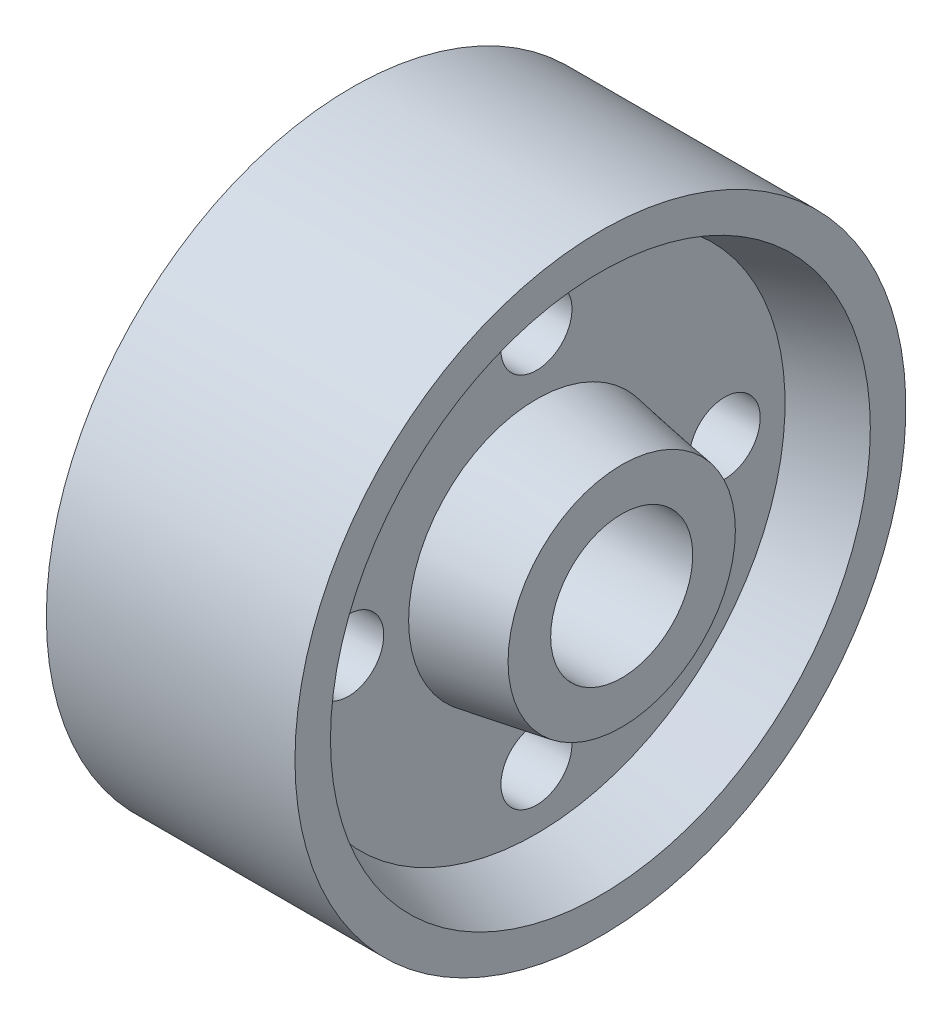
ISO-10303-21;
HEADER;
FILE_DESCRIPTION(('STEP AP214'),'2;1');
FILE_NAME('part.step','',(''),(''),'','','');
FILE_SCHEMA(('AUTOMOTIVE_DESIGN { 1 0 10303 214 1 1 1 1 }'));
ENDSEC;
DATA;
#1=APPLICATION_CONTEXT('core data for automotive mechanical design processes');
#2=APPLICATION_PROTOCOL_DEFINITION('international standard','automotive_design',2000,#1);
#3=PRODUCT_CONTEXT('',#1,'mechanical');
#4=PRODUCT('Part','Part','',(#3));
#5=PRODUCT_RELATED_PRODUCT_CATEGORY('part','',(#4));
#6=PRODUCT_DEFINITION_FORMATION('','',#4);
#7=PRODUCT_DEFINITION_CONTEXT('part definition',#1,'design');
#8=PRODUCT_DEFINITION('design','',#6,#7);
#9=PRODUCT_DEFINITION_SHAPE('','',#8);
#10=(LENGTH_UNIT() NAMED_UNIT(*) SI_UNIT(.MILLI.,.METRE.));
#11=(NAMED_UNIT(*) PLANE_ANGLE_UNIT() SI_UNIT($,.RADIAN.));
#12=(NAMED_UNIT(*) SI_UNIT($,.STERADIAN.) SOLID_ANGLE_UNIT());
#13=UNCERTAINTY_MEASURE_WITH_UNIT(LENGTH_MEASURE(1.E-05),#10,'distance_accuracy_value','');
#14=(GEOMETRIC_REPRESENTATION_CONTEXT(3) GLOBAL_UNCERTAINTY_ASSIGNED_CONTEXT((#13)) GLOBAL_UNIT_ASSIGNED_CONTEXT((#10,
#11,#12)) REPRESENTATION_CONTEXT('',''));
#15=CARTESIAN_POINT('',(0.,0.,0.));
#16=DIRECTION('',(0.,0.,1.));
#17=DIRECTION('',(1.,0.,0.));
#18=AXIS2_PLACEMENT_3D('',#15,#16,#17);
#19=CARTESIAN_POINT('',(41.,0.,0.));
#20=DIRECTION('',(-1.,0.,0.));
#21=DIRECTION('',(0.,0.,1.));
#22=AXIS2_PLACEMENT_3D('',#19,#20,#21);
#23=PLANE('',#22);
#24=CARTESIAN_POINT('',(41.,0.,0.));
#25=DIRECTION('',(-1.,0.,0.));
#26=DIRECTION('',(0.,0.,1.));
#27=AXIS2_PLACEMENT_3D('',#24,#25,#26);
#28=CIRCLE('',#27,10.);
#29=CARTESIAN_POINT('',(41.,0.,10.));
#30=VERTEX_POINT('',#29);
#31=EDGE_CURVE('E66',#30,#30,#28,.T.);
#32=ORIENTED_EDGE('',*,*,#31,.T.);
#33=EDGE_LOOP('',(#32));
#34=FACE_BOUND('',#33,.T.);
#35=CARTESIAN_POINT('',(41.,0.,0.));
#36=DIRECTION('',(-1.,0.,0.));
#37=DIRECTION('',(0.,0.,1.));
#38=AXIS2_PLACEMENT_3D('',#35,#36,#37);
#39=CIRCLE('',#38,16.);
#40=CARTESIAN_POINT('',(41.,0.,16.));
#41=VERTEX_POINT('',#40);
#42=EDGE_CURVE('E10',#41,#41,#39,.T.);
#43=ORIENTED_EDGE('',*,*,#42,.F.);
#44=EDGE_LOOP('',(#43));
#45=FACE_BOUND('',#44,.T.);
#46=ADVANCED_FACE('F43',(#34,#45),#23,.F.);
#47=CARTESIAN_POINT('',(41.,0.,0.));
#48=DIRECTION('',(-1.,0.,0.));
#49=DIRECTION('',(0.,0.,1.));
#50=AXIS2_PLACEMENT_3D('',#47,#48,#49);
#51=CONICAL_SURFACE('',#50,16.,0.165148677414626);
#52=CARTESIAN_POINT('',(29.,0.,0.));
#53=DIRECTION('',(-1.,0.,0.));
#54=DIRECTION('',(0.,0.,1.));
#55=AXIS2_PLACEMENT_3D('',#52,#53,#54);
#56=CIRCLE('',#55,18.);
#57=CARTESIAN_POINT('',(29.,0.,18.));
#58=VERTEX_POINT('',#57);
#59=EDGE_CURVE('E51',#58,#58,#56,.T.);
#60=ORIENTED_EDGE('',*,*,#59,.F.);
#61=EDGE_LOOP('',(#60));
#62=FACE_BOUND('',#61,.T.);
#63=ORIENTED_EDGE('',*,*,#42,.T.);
#64=EDGE_LOOP('',(#63));
#65=FACE_BOUND('',#64,.T.);
#66=ADVANCED_FACE('F128',(#62,#65),#51,.T.);
#67=CARTESIAN_POINT('',(29.,0.,-18.));
#68=DIRECTION('',(-1.,0.,0.));
#69=DIRECTION('',(0.,0.,1.));
#70=AXIS2_PLACEMENT_3D('',#67,#68,#69);
#71=PLANE('',#70);
#72=CARTESIAN_POINT('',(29.,26.5,0.));
#73=DIRECTION('',(-1.,0.,0.));
#74=DIRECTION('',(0.,0.,1.));
#75=AXIS2_PLACEMENT_3D('',#72,#73,#74);
#76=CIRCLE('',#75,5.);
#77=CARTESIAN_POINT('',(29.,26.5,5.));
#78=VERTEX_POINT('',#77);
#79=EDGE_CURVE('E88',#78,#78,#76,.T.);
#80=ORIENTED_EDGE('',*,*,#79,.T.);
#81=EDGE_LOOP('',(#80));
#82=FACE_BOUND('',#81,.T.);
#83=CARTESIAN_POINT('',(29.,0.,26.5));
#84=DIRECTION('',(-1.,0.,0.));
#85=DIRECTION('',(0.,0.,1.));
#86=AXIS2_PLACEMENT_3D('',#83,#84,#85);
#87=CIRCLE('',#86,4.99999999999999);
#88=CARTESIAN_POINT('',(29.,0.,31.5));
#89=VERTEX_POINT('',#88);
#90=EDGE_CURVE('E74',#89,#89,#87,.T.);
#91=ORIENTED_EDGE('',*,*,#90,.T.);
#92=EDGE_LOOP('',(#91));
#93=FACE_BOUND('',#92,.T.);
#94=CARTESIAN_POINT('',(29.,-26.5,0.));
#95=DIRECTION('',(-1.,0.,0.));
#96=DIRECTION('',(0.,0.,1.));
#97=AXIS2_PLACEMENT_3D('',#94,#95,#96);
#98=CIRCLE('',#97,5.);
#99=CARTESIAN_POINT('',(29.,-26.5,5.00000000000001));
#100=VERTEX_POINT('',#99);
#101=EDGE_CURVE('E70',#100,#100,#98,.T.);
#102=ORIENTED_EDGE('',*,*,#101,.T.);
#103=EDGE_LOOP('',(#102));
#104=FACE_BOUND('',#103,.T.);
#105=CARTESIAN_POINT('',(29.,0.,-26.5));
#106=DIRECTION('',(-1.,0.,0.));
#107=DIRECTION('',(0.,0.,1.));
#108=AXIS2_PLACEMENT_3D('',#105,#106,#107);
#109=CIRCLE('',#108,5.);
#110=CARTESIAN_POINT('',(29.,0.,-21.5));
#111=VERTEX_POINT('',#110);
#112=EDGE_CURVE('E65',#111,#111,#109,.T.);
#113=ORIENTED_EDGE('',*,*,#112,.T.);
#114=EDGE_LOOP('',(#113));
#115=FACE_BOUND('',#114,.T.);
#116=CARTESIAN_POINT('',(29.,0.,0.));
#117=DIRECTION('',(-1.,0.,0.));
#118=DIRECTION('',(0.,0.,1.));
#119=AXIS2_PLACEMENT_3D('',#116,#117,#118);
#120=CIRCLE('',#119,35.);
#121=CARTESIAN_POINT('',(29.,0.,35.));
#122=VERTEX_POINT('',#121);
#123=EDGE_CURVE('E57',#122,#122,#120,.T.);
#124=ORIENTED_EDGE('',*,*,#123,.F.);
#125=EDGE_LOOP('',(#124));
#126=FACE_BOUND('',#125,.T.);
#127=ORIENTED_EDGE('',*,*,#59,.T.);
#128=EDGE_LOOP('',(#127));
#129=FACE_BOUND('',#128,.T.);
#130=ADVANCED_FACE('F125',(#82,#93,#104,#115,#126,#129),#71,.F.);
#131=CARTESIAN_POINT('',(29.,0.,0.));
#132=DIRECTION('',(1.,0.,0.));
#133=DIRECTION('',(0.,0.,-1.));
#134=AXIS2_PLACEMENT_3D('',#131,#132,#133);
#135=CONICAL_SURFACE('',#134,35.,0.321750554396642);
#136=CARTESIAN_POINT('',(38.,0.,0.));
#137=DIRECTION('',(-1.,0.,0.));
#138=DIRECTION('',(0.,0.,1.));
#139=AXIS2_PLACEMENT_3D('',#136,#137,#138);
#140=CIRCLE('',#139,38.);
#141=CARTESIAN_POINT('',(38.,0.,38.));
#142=VERTEX_POINT('',#141);
#143=EDGE_CURVE('E116',#142,#142,#140,.T.);
#144=ORIENTED_EDGE('',*,*,#143,.F.);
#145=EDGE_LOOP('',(#144));
#146=FACE_BOUND('',#145,.T.);
#147=ORIENTED_EDGE('',*,*,#123,.T.);
#148=EDGE_LOOP('',(#147));
#149=FACE_BOUND('',#148,.T.);
#150=ADVANCED_FACE('F123',(#146,#149),#135,.F.);
#151=CARTESIAN_POINT('',(38.,0.,-38.));
#152=DIRECTION('',(-1.,0.,0.));
#153=DIRECTION('',(0.,0.,1.));
#154=AXIS2_PLACEMENT_3D('',#151,#152,#153);
#155=PLANE('',#154);
#156=CARTESIAN_POINT('',(38.,0.,0.));
#157=DIRECTION('',(-1.,0.,0.));
#158=DIRECTION('',(0.,0.,1.));
#159=AXIS2_PLACEMENT_3D('',#156,#157,#158);
#160=CIRCLE('',#159,43.);
#161=CARTESIAN_POINT('',(38.,0.,43.));
#162=VERTEX_POINT('',#161);
#163=EDGE_CURVE('E112',#162,#162,#160,.T.);
#164=ORIENTED_EDGE('',*,*,#163,.F.);
#165=EDGE_LOOP('',(#164));
#166=FACE_BOUND('',#165,.T.);
#167=ORIENTED_EDGE('',*,*,#143,.T.);
#168=EDGE_LOOP('',(#167));
#169=FACE_BOUND('',#168,.T.);
#170=ADVANCED_FACE('F141',(#166,#169),#155,.F.);
#171=CARTESIAN_POINT('',(0.,0.,0.));
#172=DIRECTION('',(-1.,0.,0.));
#173=DIRECTION('',(0.,0.,1.));
#174=AXIS2_PLACEMENT_3D('',#171,#172,#173);
#175=CYLINDRICAL_SURFACE('',#174,43.);
#176=CARTESIAN_POINT('',(2.99999999999999,0.,0.));
#177=DIRECTION('',(-1.,0.,0.));
#178=DIRECTION('',(0.,0.,1.));
#179=AXIS2_PLACEMENT_3D('',#176,#177,#178);
#180=CIRCLE('',#179,43.);
#181=CARTESIAN_POINT('',(2.99999999999999,0.,43.));
#182=VERTEX_POINT('',#181);
#183=EDGE_CURVE('E108',#182,#182,#180,.T.);
#184=ORIENTED_EDGE('',*,*,#183,.F.);
#185=EDGE_LOOP('',(#184));
#186=FACE_BOUND('',#185,.T.);
#187=ORIENTED_EDGE('',*,*,#163,.T.);
#188=EDGE_LOOP('',(#187));
#189=FACE_BOUND('',#188,.T.);
#190=ADVANCED_FACE('F145',(#186,#189),#175,.T.);
#191=CARTESIAN_POINT('',(2.99999999999999,0.,-38.));
#192=DIRECTION('',(1.,0.,0.));
#193=DIRECTION('',(0.,0.,-1.));
#194=AXIS2_PLACEMENT_3D('',#191,#192,#193);
#195=PLANE('',#194);
#196=CARTESIAN_POINT('',(2.99999999999999,0.,0.));
#197=DIRECTION('',(-1.,0.,0.));
#198=DIRECTION('',(0.,0.,1.));
#199=AXIS2_PLACEMENT_3D('',#196,#197,#198);
#200=CIRCLE('',#199,38.);
#201=CARTESIAN_POINT('',(2.99999999999999,0.,38.));
#202=VERTEX_POINT('',#201);
#203=EDGE_CURVE('E104',#202,#202,#200,.T.);
#204=ORIENTED_EDGE('',*,*,#203,.F.);
#205=EDGE_LOOP('',(#204));
#206=FACE_BOUND('',#205,.T.);
#207=ORIENTED_EDGE('',*,*,#183,.T.);
#208=EDGE_LOOP('',(#207));
#209=FACE_BOUND('',#208,.T.);
#210=ADVANCED_FACE('F149',(#206,#209),#195,.F.);
#211=CARTESIAN_POINT('',(2.99999999999999,0.,0.));
#212=DIRECTION('',(-1.,0.,0.));
#213=DIRECTION('',(0.,0.,1.));
#214=AXIS2_PLACEMENT_3D('',#211,#212,#213);
#215=CONICAL_SURFACE('',#214,38.,0.321750554396642);
#216=CARTESIAN_POINT('',(12.,0.,0.));
#217=DIRECTION('',(-1.,0.,0.));
#218=DIRECTION('',(0.,0.,1.));
#219=AXIS2_PLACEMENT_3D('',#216,#217,#218);
#220=CIRCLE('',#219,35.);
#221=CARTESIAN_POINT('',(12.,0.,35.));
#222=VERTEX_POINT('',#221);
#223=EDGE_CURVE('E100',#222,#222,#220,.T.);
#224=ORIENTED_EDGE('',*,*,#223,.F.);
#225=EDGE_LOOP('',(#224));
#226=FACE_BOUND('',#225,.T.);
#227=ORIENTED_EDGE('',*,*,#203,.T.);
#228=EDGE_LOOP('',(#227));
#229=FACE_BOUND('',#228,.T.);
#230=ADVANCED_FACE('F153',(#226,#229),#215,.F.);
#231=CARTESIAN_POINT('',(12.,0.,-18.));
#232=DIRECTION('',(1.,0.,0.));
#233=DIRECTION('',(0.,0.,-1.));
#234=AXIS2_PLACEMENT_3D('',#231,#232,#233);
#235=PLANE('',#234);
#236=CARTESIAN_POINT('',(12.,26.5,0.));
#237=DIRECTION('',(1.,0.,0.));
#238=DIRECTION('',(0.,0.,-1.));
#239=AXIS2_PLACEMENT_3D('',#236,#237,#238);
#240=CIRCLE('',#239,5.);
#241=CARTESIAN_POINT('',(12.,26.5,-5.));
#242=VERTEX_POINT('',#241);
#243=EDGE_CURVE('E46',#242,#242,#240,.T.);
#244=ORIENTED_EDGE('',*,*,#243,.T.);
#245=EDGE_LOOP('',(#244));
#246=FACE_BOUND('',#245,.T.);
#247=CARTESIAN_POINT('',(12.,0.,26.5));
#248=DIRECTION('',(1.,0.,0.));
#249=DIRECTION('',(0.,0.,-1.));
#250=AXIS2_PLACEMENT_3D('',#247,#248,#249);
#251=CIRCLE('',#250,4.99999999999999);
#252=CARTESIAN_POINT('',(12.,0.,21.5));
#253=VERTEX_POINT('',#252);
#254=EDGE_CURVE('E71',#253,#253,#251,.T.);
#255=ORIENTED_EDGE('',*,*,#254,.T.);
#256=EDGE_LOOP('',(#255));
#257=FACE_BOUND('',#256,.T.);
#258=CARTESIAN_POINT('',(12.,-26.5,0.));
#259=DIRECTION('',(1.,0.,0.));
#260=DIRECTION('',(0.,0.,-1.));
#261=AXIS2_PLACEMENT_3D('',#258,#259,#260);
#262=CIRCLE('',#261,5.);
#263=CARTESIAN_POINT('',(12.,-26.5,-5.));
#264=VERTEX_POINT('',#263);
#265=EDGE_CURVE('E67',#264,#264,#262,.T.);
#266=ORIENTED_EDGE('',*,*,#265,.T.);
#267=EDGE_LOOP('',(#266));
#268=FACE_BOUND('',#267,.T.);
#269=CARTESIAN_POINT('',(12.,0.,-26.5));
#270=DIRECTION('',(1.,0.,0.));
#271=DIRECTION('',(0.,0.,-1.));
#272=AXIS2_PLACEMENT_3D('',#269,#270,#271);
#273=CIRCLE('',#272,5.);
#274=CARTESIAN_POINT('',(12.,0.,-31.5));
#275=VERTEX_POINT('',#274);
#276=EDGE_CURVE('E61',#275,#275,#273,.T.);
#277=ORIENTED_EDGE('',*,*,#276,.T.);
#278=EDGE_LOOP('',(#277));
#279=FACE_BOUND('',#278,.T.);
#280=CARTESIAN_POINT('',(12.,0.,0.));
#281=DIRECTION('',(-1.,0.,0.));
#282=DIRECTION('',(0.,0.,1.));
#283=AXIS2_PLACEMENT_3D('',#280,#281,#282);
#284=CIRCLE('',#283,18.);
#285=CARTESIAN_POINT('',(12.,0.,18.));
#286=VERTEX_POINT('',#285);
#287=EDGE_CURVE('E96',#286,#286,#284,.T.);
#288=ORIENTED_EDGE('',*,*,#287,.F.);
#289=EDGE_LOOP('',(#288));
#290=FACE_BOUND('',#289,.T.);
#291=ORIENTED_EDGE('',*,*,#223,.T.);
#292=EDGE_LOOP('',(#291));
#293=FACE_BOUND('',#292,.T.);
#294=ADVANCED_FACE('F157',(#246,#257,#268,#279,#290,#293),#235,.F.);
#295=CARTESIAN_POINT('',(12.,0.,0.));
#296=DIRECTION('',(1.,0.,0.));
#297=DIRECTION('',(0.,0.,-1.));
#298=AXIS2_PLACEMENT_3D('',#295,#296,#297);
#299=CONICAL_SURFACE('',#298,18.,0.165148677414627);
#300=CARTESIAN_POINT('',(0.,0.,0.));
#301=DIRECTION('',(-1.,0.,0.));
#302=DIRECTION('',(0.,0.,1.));
#303=AXIS2_PLACEMENT_3D('',#300,#301,#302);
#304=CIRCLE('',#303,16.);
#305=CARTESIAN_POINT('',(0.,0.,16.));
#306=VERTEX_POINT('',#305);
#307=EDGE_CURVE('E92',#306,#306,#304,.T.);
#308=ORIENTED_EDGE('',*,*,#307,.F.);
#309=EDGE_LOOP('',(#308));
#310=FACE_BOUND('',#309,.T.);
#311=ORIENTED_EDGE('',*,*,#287,.T.);
#312=EDGE_LOOP('',(#311));
#313=FACE_BOUND('',#312,.T.);
#314=ADVANCED_FACE('F161',(#310,#313),#299,.T.);
#315=CARTESIAN_POINT('',(0.,0.,0.));
#316=DIRECTION('',(1.,0.,0.));
#317=DIRECTION('',(0.,0.,-1.));
#318=AXIS2_PLACEMENT_3D('',#315,#316,#317);
#319=PLANE('',#318);
#320=CARTESIAN_POINT('',(0.,0.,0.));
#321=DIRECTION('',(-1.,0.,0.));
#322=DIRECTION('',(0.,0.,1.));
#323=AXIS2_PLACEMENT_3D('',#320,#321,#322);
#324=CIRCLE('',#323,10.);
#325=CARTESIAN_POINT('',(0.,0.,10.));
#326=VERTEX_POINT('',#325);
#327=EDGE_CURVE('E196',#326,#326,#324,.T.);
#328=ORIENTED_EDGE('',*,*,#327,.F.);
#329=EDGE_LOOP('',(#328));
#330=FACE_BOUND('',#329,.T.);
#331=ORIENTED_EDGE('',*,*,#307,.T.);
#332=EDGE_LOOP('',(#331));
#333=FACE_BOUND('',#332,.T.);
#334=ADVANCED_FACE('F165',(#330,#333),#319,.F.);
#335=CARTESIAN_POINT('',(41.,0.,-26.5));
#336=DIRECTION('',(-1.,0.,0.));
#337=DIRECTION('',(0.,0.,1.));
#338=AXIS2_PLACEMENT_3D('',#335,#336,#337);
#339=CYLINDRICAL_SURFACE('',#338,5.);
#340=ORIENTED_EDGE('',*,*,#276,.F.);
#341=EDGE_LOOP('',(#340));
#342=FACE_BOUND('',#341,.T.);
#343=ORIENTED_EDGE('',*,*,#112,.F.);
#344=EDGE_LOOP('',(#343));
#345=FACE_BOUND('',#344,.T.);
#346=ADVANCED_FACE('F169',(#342,#345),#339,.F.);
#347=CARTESIAN_POINT('',(41.,-26.5,0.));
#348=DIRECTION('',(-1.,0.,0.));
#349=DIRECTION('',(0.,0.,1.));
#350=AXIS2_PLACEMENT_3D('',#347,#348,#349);
#351=CYLINDRICAL_SURFACE('',#350,5.);
#352=ORIENTED_EDGE('',*,*,#265,.F.);
#353=EDGE_LOOP('',(#352));
#354=FACE_BOUND('',#353,.T.);
#355=ORIENTED_EDGE('',*,*,#101,.F.);
#356=EDGE_LOOP('',(#355));
#357=FACE_BOUND('',#356,.T.);
#358=ADVANCED_FACE('F173',(#354,#357),#351,.F.);
#359=CARTESIAN_POINT('',(41.,0.,26.5));
#360=DIRECTION('',(-1.,0.,0.));
#361=DIRECTION('',(0.,0.,1.));
#362=AXIS2_PLACEMENT_3D('',#359,#360,#361);
#363=CYLINDRICAL_SURFACE('',#362,4.99999999999999);
#364=ORIENTED_EDGE('',*,*,#254,.F.);
#365=EDGE_LOOP('',(#364));
#366=FACE_BOUND('',#365,.T.);
#367=ORIENTED_EDGE('',*,*,#90,.F.);
#368=EDGE_LOOP('',(#367));
#369=FACE_BOUND('',#368,.T.);
#370=ADVANCED_FACE('F177',(#366,#369),#363,.F.);
#371=CARTESIAN_POINT('',(41.,26.5,0.));
#372=DIRECTION('',(-1.,0.,0.));
#373=DIRECTION('',(0.,0.,1.));
#374=AXIS2_PLACEMENT_3D('',#371,#372,#373);
#375=CYLINDRICAL_SURFACE('',#374,5.);
#376=ORIENTED_EDGE('',*,*,#243,.F.);
#377=EDGE_LOOP('',(#376));
#378=FACE_BOUND('',#377,.T.);
#379=ORIENTED_EDGE('',*,*,#79,.F.);
#380=EDGE_LOOP('',(#379));
#381=FACE_BOUND('',#380,.T.);
#382=ADVANCED_FACE('F181',(#378,#381),#375,.F.);
#383=CARTESIAN_POINT('',(41.,0.,0.));
#384=DIRECTION('',(-1.,0.,0.));
#385=DIRECTION('',(0.,0.,1.));
#386=AXIS2_PLACEMENT_3D('',#383,#384,#385);
#387=CYLINDRICAL_SURFACE('',#386,10.);
#388=ORIENTED_EDGE('',*,*,#31,.F.);
#389=EDGE_LOOP('',(#388));
#390=FACE_BOUND('',#389,.T.);
#391=ORIENTED_EDGE('',*,*,#327,.T.);
#392=EDGE_LOOP('',(#391));
#393=FACE_BOUND('',#392,.T.);
#394=ADVANCED_FACE('F185',(#390,#393),#387,.F.);
#395=CLOSED_SHELL('',(#46,#66,#130,#150,#170,#190,#210,#230,#294,#314,#334,#346,#358,#370,#382,#394));
#396=MANIFOLD_SOLID_BREP('B2',#395);
#397=ADVANCED_BREP_SHAPE_REPRESENTATION('',(#18,#396),#14);
#398=SHAPE_DEFINITION_REPRESENTATION(#9,#397);
ENDSEC;
END-ISO-10303-21;
